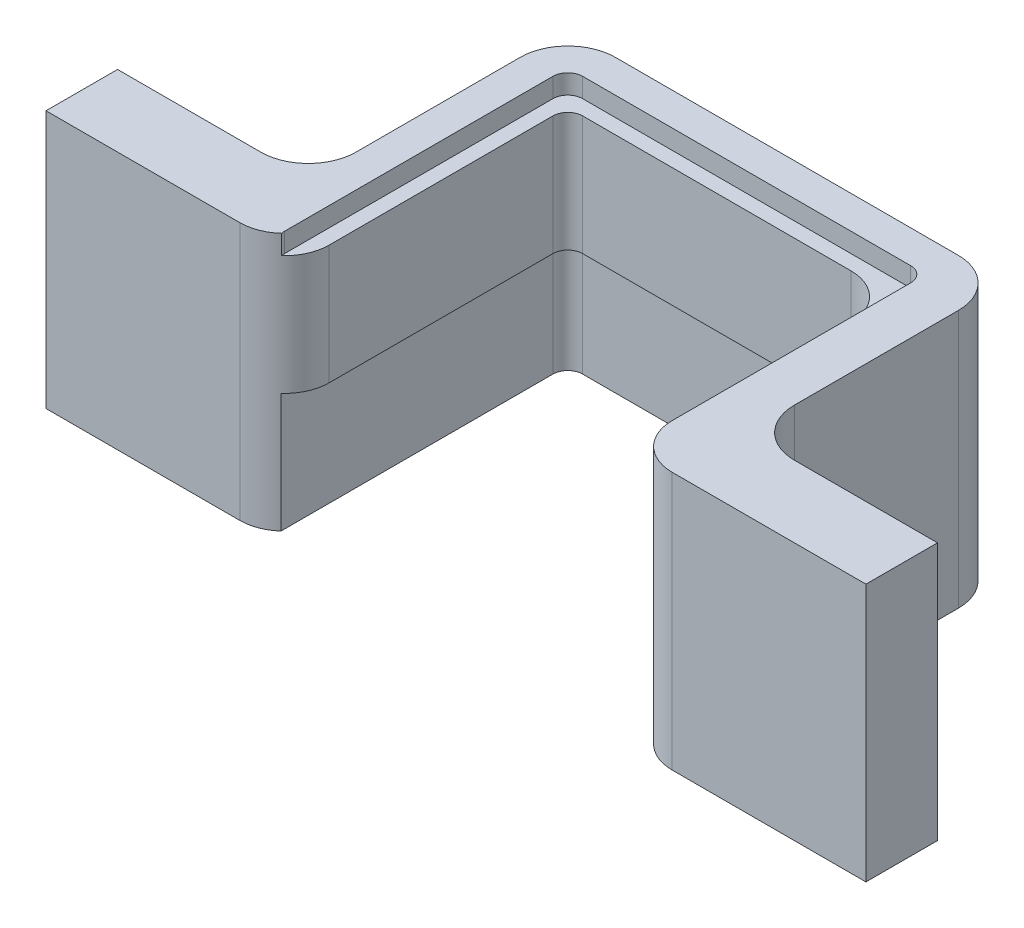
ISO-10303-21;
HEADER;
FILE_DESCRIPTION(('STEP AP214'),'2;1');
FILE_NAME('part.step','',(''),(''),'','','');
FILE_SCHEMA(('AUTOMOTIVE_DESIGN { 1 0 10303 214 1 1 1 1 }'));
ENDSEC;
DATA;
#1=APPLICATION_CONTEXT('core data for automotive mechanical design processes');
#2=APPLICATION_PROTOCOL_DEFINITION('international standard','automotive_design',2000,#1);
#3=PRODUCT_CONTEXT('',#1,'mechanical');
#4=PRODUCT('Part','Part','',(#3));
#5=PRODUCT_RELATED_PRODUCT_CATEGORY('part','',(#4));
#6=PRODUCT_DEFINITION_FORMATION('','',#4);
#7=PRODUCT_DEFINITION_CONTEXT('part definition',#1,'design');
#8=PRODUCT_DEFINITION('design','',#6,#7);
#9=PRODUCT_DEFINITION_SHAPE('','',#8);
#10=(LENGTH_UNIT() NAMED_UNIT(*) SI_UNIT(.MILLI.,.METRE.));
#11=(NAMED_UNIT(*) PLANE_ANGLE_UNIT() SI_UNIT($,.RADIAN.));
#12=(NAMED_UNIT(*) SI_UNIT($,.STERADIAN.) SOLID_ANGLE_UNIT());
#13=UNCERTAINTY_MEASURE_WITH_UNIT(LENGTH_MEASURE(1.E-05),#10,'distance_accuracy_value','');
#14=(GEOMETRIC_REPRESENTATION_CONTEXT(3) GLOBAL_UNCERTAINTY_ASSIGNED_CONTEXT((#13)) GLOBAL_UNIT_ASSIGNED_CONTEXT((#10,
#11,#12)) REPRESENTATION_CONTEXT('',''));
#15=CARTESIAN_POINT('',(0.,0.,0.));
#16=DIRECTION('',(0.,0.,1.));
#17=DIRECTION('',(1.,0.,0.));
#18=AXIS2_PLACEMENT_3D('',#15,#16,#17);
#19=CARTESIAN_POINT('',(-5.5,4.,3.00203961497151));
#20=DIRECTION('',(-1.,0.,0.));
#21=DIRECTION('',(0.,0.,1.));
#22=AXIS2_PLACEMENT_3D('',#19,#20,#21);
#23=PLANE('',#22);
#24=DIRECTION('',(0.,0.,-1.));
#25=VECTOR('',#24,1.);
#26=CARTESIAN_POINT('',(-5.5,0.,3.00203961497151));
#27=LINE('',#26,#25);
#28=CARTESIAN_POINT('',(-5.5,0.,3.49999999999999));
#29=VERTEX_POINT('',#28);
#30=CARTESIAN_POINT('',(-5.5,0.,-4.));
#31=VERTEX_POINT('',#30);
#32=EDGE_CURVE('E432',#29,#31,#27,.T.);
#33=ORIENTED_EDGE('',*,*,#32,.T.);
#34=DIRECTION('',(0.,-1.,0.));
#35=VECTOR('',#34,1.);
#36=CARTESIAN_POINT('',(-5.5,4.,-4.));
#37=LINE('',#36,#35);
#38=CARTESIAN_POINT('',(-5.5,4.,-4.));
#39=VERTEX_POINT('',#38);
#40=EDGE_CURVE('E11',#39,#31,#37,.T.);
#41=ORIENTED_EDGE('',*,*,#40,.F.);
#42=DIRECTION('',(0.,0.,-1.));
#43=VECTOR('',#42,1.);
#44=CARTESIAN_POINT('',(-5.5,4.,3.00203961497151));
#45=LINE('',#44,#43);
#46=CARTESIAN_POINT('',(-5.5,4.,3.49999999999999));
#47=VERTEX_POINT('',#46);
#48=EDGE_CURVE('E433',#47,#39,#45,.T.);
#49=ORIENTED_EDGE('',*,*,#48,.F.);
#50=DIRECTION('',(0.,-1.,0.));
#51=VECTOR('',#50,1.);
#52=CARTESIAN_POINT('',(-5.5,4.,3.49999999999999));
#53=LINE('',#52,#51);
#54=EDGE_CURVE('E448',#47,#29,#53,.T.);
#55=ORIENTED_EDGE('',*,*,#54,.T.);
#56=EDGE_LOOP('',(#33,#41,#49,#55));
#57=FACE_BOUND('',#56,.T.);
#58=ADVANCED_FACE('F35',(#57),#23,.F.);
#59=CARTESIAN_POINT('',(-5.,4.,-4.));
#60=DIRECTION('',(0.,-1.,0.));
#61=DIRECTION('',(0.,0.,-1.));
#62=AXIS2_PLACEMENT_3D('',#59,#60,#61);
#63=CYLINDRICAL_SURFACE('',#62,0.5);
#64=CARTESIAN_POINT('',(-5.,0.,-4.));
#65=DIRECTION('',(0.,-1.,0.));
#66=DIRECTION('',(0.,0.,-1.));
#67=AXIS2_PLACEMENT_3D('',#64,#65,#66);
#68=CIRCLE('',#67,0.5);
#69=CARTESIAN_POINT('',(-5.,0.,-4.5));
#70=VERTEX_POINT('',#69);
#71=EDGE_CURVE('E450',#31,#70,#68,.T.);
#72=ORIENTED_EDGE('',*,*,#71,.T.);
#73=DIRECTION('',(0.,-1.,0.));
#74=VECTOR('',#73,1.);
#75=CARTESIAN_POINT('',(-5.,4.,-4.5));
#76=LINE('',#75,#74);
#77=CARTESIAN_POINT('',(-5.,4.,-4.5));
#78=VERTEX_POINT('',#77);
#79=EDGE_CURVE('E42',#78,#70,#76,.T.);
#80=ORIENTED_EDGE('',*,*,#79,.F.);
#81=CARTESIAN_POINT('',(-5.,4.,-4.));
#82=DIRECTION('',(0.,-1.,0.));
#83=DIRECTION('',(0.,0.,-1.));
#84=AXIS2_PLACEMENT_3D('',#81,#82,#83);
#85=CIRCLE('',#84,0.5);
#86=EDGE_CURVE('E435',#39,#78,#85,.T.);
#87=ORIENTED_EDGE('',*,*,#86,.F.);
#88=ORIENTED_EDGE('',*,*,#40,.T.);
#89=EDGE_LOOP('',(#72,#80,#87,#88));
#90=FACE_BOUND('',#89,.T.);
#91=ADVANCED_FACE('F533',(#90),#63,.F.);
#92=CARTESIAN_POINT('',(4.,4.,-4.5));
#93=DIRECTION('',(0.,0.,-1.));
#94=DIRECTION('',(-1.,0.,0.));
#95=AXIS2_PLACEMENT_3D('',#92,#93,#94);
#96=PLANE('',#95);
#97=DIRECTION('',(1.,0.,0.));
#98=VECTOR('',#97,1.);
#99=CARTESIAN_POINT('',(4.,0.,-4.5));
#100=LINE('',#99,#98);
#101=CARTESIAN_POINT('',(4.,0.,-4.5));
#102=VERTEX_POINT('',#101);
#103=EDGE_CURVE('E452',#70,#102,#100,.T.);
#104=ORIENTED_EDGE('',*,*,#103,.T.);
#105=DIRECTION('',(0.,-1.,0.));
#106=VECTOR('',#105,1.);
#107=CARTESIAN_POINT('',(4.,4.,-4.5));
#108=LINE('',#107,#106);
#109=CARTESIAN_POINT('',(4.,4.,-4.5));
#110=VERTEX_POINT('',#109);
#111=EDGE_CURVE('E502',#110,#102,#108,.T.);
#112=ORIENTED_EDGE('',*,*,#111,.F.);
#113=DIRECTION('',(1.,0.,0.));
#114=VECTOR('',#113,1.);
#115=CARTESIAN_POINT('',(4.,4.,-4.5));
#116=LINE('',#115,#114);
#117=EDGE_CURVE('E438',#78,#110,#116,.T.);
#118=ORIENTED_EDGE('',*,*,#117,.F.);
#119=ORIENTED_EDGE('',*,*,#79,.T.);
#120=EDGE_LOOP('',(#104,#112,#118,#119));
#121=FACE_BOUND('',#120,.T.);
#122=ADVANCED_FACE('F509',(#121),#96,.F.);
#123=CARTESIAN_POINT('',(4.,4.,-3.));
#124=DIRECTION('',(0.,-1.,0.));
#125=DIRECTION('',(0.,0.,-1.));
#126=AXIS2_PLACEMENT_3D('',#123,#124,#125);
#127=CYLINDRICAL_SURFACE('',#126,1.5);
#128=CARTESIAN_POINT('',(4.,0.,-3.));
#129=DIRECTION('',(0.,-1.,0.));
#130=DIRECTION('',(0.,0.,-1.));
#131=AXIS2_PLACEMENT_3D('',#128,#129,#130);
#132=CIRCLE('',#131,1.5);
#133=CARTESIAN_POINT('',(5.5,0.,-3.));
#134=VERTEX_POINT('',#133);
#135=EDGE_CURVE('E454',#102,#134,#132,.T.);
#136=ORIENTED_EDGE('',*,*,#135,.T.);
#137=DIRECTION('',(0.,-1.,0.));
#138=VECTOR('',#137,1.);
#139=CARTESIAN_POINT('',(5.5,4.,-3.));
#140=LINE('',#139,#138);
#141=CARTESIAN_POINT('',(5.5,4.,-3.));
#142=VERTEX_POINT('',#141);
#143=EDGE_CURVE('E499',#142,#134,#140,.T.);
#144=ORIENTED_EDGE('',*,*,#143,.F.);
#145=CARTESIAN_POINT('',(4.,4.,-3.));
#146=DIRECTION('',(0.,-1.,0.));
#147=DIRECTION('',(0.,0.,-1.));
#148=AXIS2_PLACEMENT_3D('',#145,#146,#147);
#149=CIRCLE('',#148,1.5);
#150=EDGE_CURVE('E440',#110,#142,#149,.T.);
#151=ORIENTED_EDGE('',*,*,#150,.F.);
#152=ORIENTED_EDGE('',*,*,#111,.T.);
#153=EDGE_LOOP('',(#136,#144,#151,#152));
#154=FACE_BOUND('',#153,.T.);
#155=ADVANCED_FACE('F521',(#154),#127,.F.);
#156=CARTESIAN_POINT('',(5.5,4.,-3.));
#157=DIRECTION('',(1.,0.,0.));
#158=DIRECTION('',(0.,0.,-1.));
#159=AXIS2_PLACEMENT_3D('',#156,#157,#158);
#160=PLANE('',#159);
#161=DIRECTION('',(0.,0.,1.));
#162=VECTOR('',#161,1.);
#163=CARTESIAN_POINT('',(5.5,0.,-3.));
#164=LINE('',#163,#162);
#165=CARTESIAN_POINT('',(5.5,0.,-1.5));
#166=VERTEX_POINT('',#165);
#167=EDGE_CURVE('E456',#134,#166,#164,.T.);
#168=ORIENTED_EDGE('',*,*,#167,.T.);
#169=DIRECTION('',(0.,-1.,0.));
#170=VECTOR('',#169,1.);
#171=CARTESIAN_POINT('',(5.5,4.,-1.5));
#172=LINE('',#171,#170);
#173=CARTESIAN_POINT('',(5.5,4.,-1.5));
#174=VERTEX_POINT('',#173);
#175=EDGE_CURVE('E496',#174,#166,#172,.T.);
#176=ORIENTED_EDGE('',*,*,#175,.F.);
#177=DIRECTION('',(0.,0.,1.));
#178=VECTOR('',#177,1.);
#179=CARTESIAN_POINT('',(5.5,4.,-3.));
#180=LINE('',#179,#178);
#181=EDGE_CURVE('E442',#142,#174,#180,.T.);
#182=ORIENTED_EDGE('',*,*,#181,.F.);
#183=ORIENTED_EDGE('',*,*,#143,.T.);
#184=EDGE_LOOP('',(#168,#176,#182,#183));
#185=FACE_BOUND('',#184,.T.);
#186=ADVANCED_FACE('F525',(#185),#160,.F.);
#187=CARTESIAN_POINT('',(5.5,4.,-1.5));
#188=DIRECTION('',(0.,0.,-1.));
#189=DIRECTION('',(-1.,0.,0.));
#190=AXIS2_PLACEMENT_3D('',#187,#188,#189);
#191=PLANE('',#190);
#192=DIRECTION('',(1.,0.,0.));
#193=VECTOR('',#192,1.);
#194=CARTESIAN_POINT('',(5.5,0.,-1.5));
#195=LINE('',#194,#193);
#196=CARTESIAN_POINT('',(6.,0.,-1.5));
#197=VERTEX_POINT('',#196);
#198=EDGE_CURVE('E458',#166,#197,#195,.T.);
#199=ORIENTED_EDGE('',*,*,#198,.T.);
#200=DIRECTION('',(0.,-1.,0.));
#201=VECTOR('',#200,1.);
#202=CARTESIAN_POINT('',(6.,4.,-1.5));
#203=LINE('',#202,#201);
#204=CARTESIAN_POINT('',(6.,4.,-1.5));
#205=VERTEX_POINT('',#204);
#206=EDGE_CURVE('E494',#205,#197,#203,.T.);
#207=ORIENTED_EDGE('',*,*,#206,.F.);
#208=DIRECTION('',(1.,0.,0.));
#209=VECTOR('',#208,1.);
#210=CARTESIAN_POINT('',(5.5,4.,-1.5));
#211=LINE('',#210,#209);
#212=EDGE_CURVE('E444',#174,#205,#211,.T.);
#213=ORIENTED_EDGE('',*,*,#212,.F.);
#214=ORIENTED_EDGE('',*,*,#175,.T.);
#215=EDGE_LOOP('',(#199,#207,#213,#214));
#216=FACE_BOUND('',#215,.T.);
#217=ADVANCED_FACE('F645',(#216),#191,.F.);
#218=CARTESIAN_POINT('',(6.,4.,-1.5));
#219=DIRECTION('',(1.,0.,0.));
#220=DIRECTION('',(0.,0.,-1.));
#221=AXIS2_PLACEMENT_3D('',#218,#219,#220);
#222=PLANE('',#221);
#223=ORIENTED_EDGE('',*,*,#206,.T.);
#224=DIRECTION('',(0.,0.,1.));
#225=VECTOR('',#224,1.);
#226=CARTESIAN_POINT('',(6.,0.,0.));
#227=LINE('',#226,#225);
#228=CARTESIAN_POINT('',(6.,0.,-4.5));
#229=VERTEX_POINT('',#228);
#230=EDGE_CURVE('E254',#229,#197,#227,.T.);
#231=ORIENTED_EDGE('',*,*,#230,.F.);
#232=DIRECTION('',(0.,1.,0.));
#233=VECTOR('',#232,1.);
#234=CARTESIAN_POINT('',(6.,-4.,-4.5));
#235=LINE('',#234,#233);
#236=CARTESIAN_POINT('',(6.,-4.,-4.5));
#237=VERTEX_POINT('',#236);
#238=EDGE_CURVE('E248',#237,#229,#235,.T.);
#239=ORIENTED_EDGE('',*,*,#238,.F.);
#240=DIRECTION('',(0.,0.,1.));
#241=VECTOR('',#240,1.);
#242=CARTESIAN_POINT('',(6.,-4.,0.));
#243=LINE('',#242,#241);
#244=CARTESIAN_POINT('',(6.,-4.,3.49999999999999));
#245=VERTEX_POINT('',#244);
#246=EDGE_CURVE('E253',#237,#245,#243,.T.);
#247=ORIENTED_EDGE('',*,*,#246,.T.);
#248=DIRECTION('',(0.,-1.,0.));
#249=VECTOR('',#248,1.);
#250=CARTESIAN_POINT('',(6.,4.,3.49999999999999));
#251=LINE('',#250,#249);
#252=CARTESIAN_POINT('',(6.,4.65,3.50000000000001));
#253=VERTEX_POINT('',#252);
#254=EDGE_CURVE('E492',#253,#245,#251,.T.);
#255=ORIENTED_EDGE('',*,*,#254,.F.);
#256=DIRECTION('',(0.,0.,1.));
#257=VECTOR('',#256,1.);
#258=CARTESIAN_POINT('',(6.,4.65,3.50000000000001));
#259=LINE('',#258,#257);
#260=CARTESIAN_POINT('',(6.,4.65,-4.5));
#261=VERTEX_POINT('',#260);
#262=EDGE_CURVE('E342',#261,#253,#259,.T.);
#263=ORIENTED_EDGE('',*,*,#262,.F.);
#264=DIRECTION('',(0.,-1.,0.));
#265=VECTOR('',#264,1.);
#266=CARTESIAN_POINT('',(6.,4.65,-4.5));
#267=LINE('',#266,#265);
#268=CARTESIAN_POINT('',(6.,4.,-4.5));
#269=VERTEX_POINT('',#268);
#270=EDGE_CURVE('E429',#261,#269,#267,.T.);
#271=ORIENTED_EDGE('',*,*,#270,.T.);
#272=DIRECTION('',(0.,0.,1.));
#273=VECTOR('',#272,1.);
#274=CARTESIAN_POINT('',(6.,4.,3.50000000000001));
#275=LINE('',#274,#273);
#276=EDGE_CURVE('E401',#269,#205,#275,.T.);
#277=ORIENTED_EDGE('',*,*,#276,.T.);
#278=EDGE_LOOP('',(#223,#231,#239,#247,#255,#263,#271,#277));
#279=FACE_BOUND('',#278,.T.);
#280=ADVANCED_FACE('F251',(#279),#222,.F.);
#281=CARTESIAN_POINT('',(7.5,4.,3.5));
#282=DIRECTION('',(0.,-1.,0.));
#283=DIRECTION('',(0.,0.,-1.));
#284=AXIS2_PLACEMENT_3D('',#281,#282,#283);
#285=CYLINDRICAL_SURFACE('',#284,1.5);
#286=ORIENTED_EDGE('',*,*,#254,.T.);
#287=CARTESIAN_POINT('',(7.5,-4.,3.5));
#288=DIRECTION('',(0.,-1.,0.));
#289=DIRECTION('',(0.,0.,-1.));
#290=AXIS2_PLACEMENT_3D('',#287,#288,#289);
#291=CIRCLE('',#290,1.5);
#292=CARTESIAN_POINT('',(7.50000000000001,-4.,5.));
#293=VERTEX_POINT('',#292);
#294=EDGE_CURVE('E273',#293,#245,#291,.T.);
#295=ORIENTED_EDGE('',*,*,#294,.F.);
#296=DIRECTION('',(0.,-1.,0.));
#297=VECTOR('',#296,1.);
#298=CARTESIAN_POINT('',(7.50000000000001,4.,5.));
#299=LINE('',#298,#297);
#300=CARTESIAN_POINT('',(7.5,4.65,5.));
#301=VERTEX_POINT('',#300);
#302=EDGE_CURVE('E490',#301,#293,#299,.T.);
#303=ORIENTED_EDGE('',*,*,#302,.F.);
#304=CARTESIAN_POINT('',(7.5,4.65,3.5));
#305=DIRECTION('',(0.,1.,0.));
#306=DIRECTION('',(0.,0.,1.));
#307=AXIS2_PLACEMENT_3D('',#304,#305,#306);
#308=CIRCLE('',#307,1.5);
#309=EDGE_CURVE('E346',#253,#301,#308,.T.);
#310=ORIENTED_EDGE('',*,*,#309,.F.);
#311=EDGE_LOOP('',(#286,#295,#303,#310));
#312=FACE_BOUND('',#311,.T.);
#313=ADVANCED_FACE('F601',(#312),#285,.T.);
#314=CARTESIAN_POINT('',(7.50000000000001,4.,5.));
#315=DIRECTION('',(0.,0.,-1.));
#316=DIRECTION('',(-1.,0.,0.));
#317=AXIS2_PLACEMENT_3D('',#314,#315,#316);
#318=PLANE('',#317);
#319=ORIENTED_EDGE('',*,*,#302,.T.);
#320=DIRECTION('',(-1.,0.,0.));
#321=VECTOR('',#320,1.);
#322=CARTESIAN_POINT('',(0.,-4.,5.));
#323=LINE('',#322,#321);
#324=CARTESIAN_POINT('',(14.,-4.,5.));
#325=VERTEX_POINT('',#324);
#326=EDGE_CURVE('E321',#325,#293,#323,.T.);
#327=ORIENTED_EDGE('',*,*,#326,.F.);
#328=DIRECTION('',(0.,-1.,0.));
#329=VECTOR('',#328,1.);
#330=CARTESIAN_POINT('',(14.,4.,5.));
#331=LINE('',#330,#329);
#332=CARTESIAN_POINT('',(14.,4.65,5.));
#333=VERTEX_POINT('',#332);
#334=EDGE_CURVE('E488',#333,#325,#331,.T.);
#335=ORIENTED_EDGE('',*,*,#334,.F.);
#336=DIRECTION('',(1.,0.,0.));
#337=VECTOR('',#336,1.);
#338=CARTESIAN_POINT('',(14.,4.65,5.));
#339=LINE('',#338,#337);
#340=EDGE_CURVE('E349',#301,#333,#339,.T.);
#341=ORIENTED_EDGE('',*,*,#340,.F.);
#342=EDGE_LOOP('',(#319,#327,#335,#341));
#343=FACE_BOUND('',#342,.T.);
#344=ADVANCED_FACE('F598',(#343),#318,.F.);
#345=CARTESIAN_POINT('',(14.,4.,2.6));
#346=DIRECTION('',(-1.,0.,0.));
#347=DIRECTION('',(0.,0.,1.));
#348=AXIS2_PLACEMENT_3D('',#345,#346,#347);
#349=PLANE('',#348);
#350=ORIENTED_EDGE('',*,*,#334,.T.);
#351=DIRECTION('',(0.,0.,1.));
#352=VECTOR('',#351,1.);
#353=CARTESIAN_POINT('',(14.,-4.,0.));
#354=LINE('',#353,#352);
#355=CARTESIAN_POINT('',(14.,-4.,2.6));
#356=VERTEX_POINT('',#355);
#357=EDGE_CURVE('E318',#356,#325,#354,.T.);
#358=ORIENTED_EDGE('',*,*,#357,.F.);
#359=DIRECTION('',(0.,-1.,0.));
#360=VECTOR('',#359,1.);
#361=CARTESIAN_POINT('',(14.,4.,2.6));
#362=LINE('',#361,#360);
#363=CARTESIAN_POINT('',(14.,4.65,2.6));
#364=VERTEX_POINT('',#363);
#365=EDGE_CURVE('E486',#364,#356,#362,.T.);
#366=ORIENTED_EDGE('',*,*,#365,.F.);
#367=DIRECTION('',(0.,0.,-1.));
#368=VECTOR('',#367,1.);
#369=CARTESIAN_POINT('',(14.,4.65,2.6));
#370=LINE('',#369,#368);
#371=EDGE_CURVE('E352',#333,#364,#370,.T.);
#372=ORIENTED_EDGE('',*,*,#371,.F.);
#373=EDGE_LOOP('',(#350,#358,#366,#372));
#374=FACE_BOUND('',#373,.T.);
#375=ADVANCED_FACE('F594',(#374),#349,.F.);
#376=CARTESIAN_POINT('',(9.2,4.,2.6));
#377=DIRECTION('',(0.,0.,1.));
#378=DIRECTION('',(1.,0.,0.));
#379=AXIS2_PLACEMENT_3D('',#376,#377,#378);
#380=PLANE('',#379);
#381=ORIENTED_EDGE('',*,*,#365,.T.);
#382=DIRECTION('',(1.,0.,0.));
#383=VECTOR('',#382,1.);
#384=CARTESIAN_POINT('',(0.,-4.,2.6));
#385=LINE('',#384,#383);
#386=CARTESIAN_POINT('',(9.2,-4.,2.6));
#387=VERTEX_POINT('',#386);
#388=EDGE_CURVE('E315',#387,#356,#385,.T.);
#389=ORIENTED_EDGE('',*,*,#388,.F.);
#390=DIRECTION('',(0.,-1.,0.));
#391=VECTOR('',#390,1.);
#392=CARTESIAN_POINT('',(9.2,4.,2.6));
#393=LINE('',#392,#391);
#394=CARTESIAN_POINT('',(9.20000000000001,4.65,2.6));
#395=VERTEX_POINT('',#394);
#396=EDGE_CURVE('E484',#395,#387,#393,.T.);
#397=ORIENTED_EDGE('',*,*,#396,.F.);
#398=DIRECTION('',(-1.,0.,0.));
#399=VECTOR('',#398,1.);
#400=CARTESIAN_POINT('',(14.,4.65,2.6));
#401=LINE('',#400,#399);
#402=EDGE_CURVE('E355',#364,#395,#401,.T.);
#403=ORIENTED_EDGE('',*,*,#402,.F.);
#404=EDGE_LOOP('',(#381,#389,#397,#403));
#405=FACE_BOUND('',#404,.T.);
#406=ADVANCED_FACE('F590',(#405),#380,.F.);
#407=CARTESIAN_POINT('',(9.2,4.,0.999999999999999));
#408=DIRECTION('',(0.,-1.,0.));
#409=DIRECTION('',(0.,0.,-1.));
#410=AXIS2_PLACEMENT_3D('',#407,#408,#409);
#411=CYLINDRICAL_SURFACE('',#410,1.6);
#412=ORIENTED_EDGE('',*,*,#396,.T.);
#413=CARTESIAN_POINT('',(9.2,-4.,0.999999999999999));
#414=DIRECTION('',(0.,-1.,0.));
#415=DIRECTION('',(0.,0.,-1.));
#416=AXIS2_PLACEMENT_3D('',#413,#414,#415);
#417=CIRCLE('',#416,1.6);
#418=CARTESIAN_POINT('',(7.6,-4.,1.));
#419=VERTEX_POINT('',#418);
#420=EDGE_CURVE('E312',#419,#387,#417,.F.);
#421=ORIENTED_EDGE('',*,*,#420,.F.);
#422=DIRECTION('',(0.,-1.,0.));
#423=VECTOR('',#422,1.);
#424=CARTESIAN_POINT('',(7.6,4.,1.));
#425=LINE('',#424,#423);
#426=CARTESIAN_POINT('',(7.6,4.65,0.999999999999988));
#427=VERTEX_POINT('',#426);
#428=EDGE_CURVE('E482',#427,#419,#425,.T.);
#429=ORIENTED_EDGE('',*,*,#428,.F.);
#430=CARTESIAN_POINT('',(9.2,4.65,0.999999999999999));
#431=DIRECTION('',(0.,-1.,0.));
#432=DIRECTION('',(0.,0.,1.));
#433=AXIS2_PLACEMENT_3D('',#430,#431,#432);
#434=CIRCLE('',#433,1.6);
#435=EDGE_CURVE('E358',#395,#427,#434,.T.);
#436=ORIENTED_EDGE('',*,*,#435,.F.);
#437=EDGE_LOOP('',(#412,#421,#429,#436));
#438=FACE_BOUND('',#437,.T.);
#439=ADVANCED_FACE('F587',(#438),#411,.F.);
#440=CARTESIAN_POINT('',(7.6,4.,-4.49999999999999));
#441=DIRECTION('',(-1.,0.,0.));
#442=DIRECTION('',(0.,0.,1.));
#443=AXIS2_PLACEMENT_3D('',#440,#441,#442);
#444=PLANE('',#443);
#445=ORIENTED_EDGE('',*,*,#428,.T.);
#446=DIRECTION('',(0.,0.,1.));
#447=VECTOR('',#446,1.);
#448=CARTESIAN_POINT('',(7.6,-4.,0.));
#449=LINE('',#448,#447);
#450=CARTESIAN_POINT('',(7.6,-4.,-4.49999999999999));
#451=VERTEX_POINT('',#450);
#452=EDGE_CURVE('E309',#451,#419,#449,.T.);
#453=ORIENTED_EDGE('',*,*,#452,.F.);
#454=DIRECTION('',(0.,-1.,0.));
#455=VECTOR('',#454,1.);
#456=CARTESIAN_POINT('',(7.6,4.,-4.49999999999999));
#457=LINE('',#456,#455);
#458=CARTESIAN_POINT('',(7.6,4.65,-4.49999999999999));
#459=VERTEX_POINT('',#458);
#460=EDGE_CURVE('E480',#459,#451,#457,.T.);
#461=ORIENTED_EDGE('',*,*,#460,.F.);
#462=DIRECTION('',(0.,0.,-1.));
#463=VECTOR('',#462,1.);
#464=CARTESIAN_POINT('',(7.6,4.65,-4.49999999999999));
#465=LINE('',#464,#463);
#466=EDGE_CURVE('E361',#427,#459,#465,.T.);
#467=ORIENTED_EDGE('',*,*,#466,.F.);
#468=EDGE_LOOP('',(#445,#453,#461,#467));
#469=FACE_BOUND('',#468,.T.);
#470=ADVANCED_FACE('F582',(#469),#444,.F.);
#471=CARTESIAN_POINT('',(6.,4.,-4.5));
#472=DIRECTION('',(0.,-1.,0.));
#473=DIRECTION('',(0.,0.,-1.));
#474=AXIS2_PLACEMENT_3D('',#471,#472,#473);
#475=CYLINDRICAL_SURFACE('',#474,1.6);
#476=ORIENTED_EDGE('',*,*,#460,.T.);
#477=CARTESIAN_POINT('',(6.,-4.,-4.5));
#478=DIRECTION('',(0.,-1.,0.));
#479=DIRECTION('',(0.,0.,-1.));
#480=AXIS2_PLACEMENT_3D('',#477,#478,#479);
#481=CIRCLE('',#480,1.6);
#482=CARTESIAN_POINT('',(6.,-4.,-6.1));
#483=VERTEX_POINT('',#482);
#484=EDGE_CURVE('E306',#483,#451,#481,.T.);
#485=ORIENTED_EDGE('',*,*,#484,.F.);
#486=DIRECTION('',(0.,-1.,0.));
#487=VECTOR('',#486,1.);
#488=CARTESIAN_POINT('',(5.99999999999999,4.,-6.1));
#489=LINE('',#488,#487);
#490=CARTESIAN_POINT('',(5.99999999999999,4.65,-6.1));
#491=VERTEX_POINT('',#490);
#492=EDGE_CURVE('E478',#491,#483,#489,.T.);
#493=ORIENTED_EDGE('',*,*,#492,.F.);
#494=CARTESIAN_POINT('',(6.,4.65,-4.5));
#495=DIRECTION('',(0.,1.,0.));
#496=DIRECTION('',(0.,0.,1.));
#497=AXIS2_PLACEMENT_3D('',#494,#495,#496);
#498=CIRCLE('',#497,1.6);
#499=EDGE_CURVE('E364',#459,#491,#498,.T.);
#500=ORIENTED_EDGE('',*,*,#499,.F.);
#501=EDGE_LOOP('',(#476,#485,#493,#500));
#502=FACE_BOUND('',#501,.T.);
#503=ADVANCED_FACE('F578',(#502),#475,.T.);
#504=CARTESIAN_POINT('',(-5.49999999999999,4.,-6.1));
#505=DIRECTION('',(0.,0.,1.));
#506=DIRECTION('',(1.,0.,0.));
#507=AXIS2_PLACEMENT_3D('',#504,#505,#506);
#508=PLANE('',#507);
#509=ORIENTED_EDGE('',*,*,#492,.T.);
#510=DIRECTION('',(1.,0.,0.));
#511=VECTOR('',#510,1.);
#512=CARTESIAN_POINT('',(0.,-4.,-6.1));
#513=LINE('',#512,#511);
#514=CARTESIAN_POINT('',(-5.49999999999999,-4.,-6.1));
#515=VERTEX_POINT('',#514);
#516=EDGE_CURVE('E303',#515,#483,#513,.T.);
#517=ORIENTED_EDGE('',*,*,#516,.F.);
#518=DIRECTION('',(0.,-1.,0.));
#519=VECTOR('',#518,1.);
#520=CARTESIAN_POINT('',(-5.49999999999999,4.,-6.1));
#521=LINE('',#520,#519);
#522=CARTESIAN_POINT('',(-5.49999999999999,4.65,-6.1));
#523=VERTEX_POINT('',#522);
#524=EDGE_CURVE('E476',#523,#515,#521,.T.);
#525=ORIENTED_EDGE('',*,*,#524,.F.);
#526=DIRECTION('',(-1.,0.,0.));
#527=VECTOR('',#526,1.);
#528=CARTESIAN_POINT('',(-5.49999999999999,4.65,-6.1));
#529=LINE('',#528,#527);
#530=EDGE_CURVE('E367',#491,#523,#529,.T.);
#531=ORIENTED_EDGE('',*,*,#530,.F.);
#532=EDGE_LOOP('',(#509,#517,#525,#531));
#533=FACE_BOUND('',#532,.T.);
#534=ADVANCED_FACE('F575',(#533),#508,.F.);
#535=CARTESIAN_POINT('',(-5.5,4.,-4.5));
#536=DIRECTION('',(0.,-1.,0.));
#537=DIRECTION('',(0.,0.,-1.));
#538=AXIS2_PLACEMENT_3D('',#535,#536,#537);
#539=CYLINDRICAL_SURFACE('',#538,1.6);
#540=ORIENTED_EDGE('',*,*,#524,.T.);
#541=CARTESIAN_POINT('',(-5.5,-4.,-4.5));
#542=DIRECTION('',(0.,-1.,0.));
#543=DIRECTION('',(0.,0.,-1.));
#544=AXIS2_PLACEMENT_3D('',#541,#542,#543);
#545=CIRCLE('',#544,1.6);
#546=CARTESIAN_POINT('',(-7.1,-4.,-4.49999999999999));
#547=VERTEX_POINT('',#546);
#548=EDGE_CURVE('E300',#547,#515,#545,.T.);
#549=ORIENTED_EDGE('',*,*,#548,.F.);
#550=DIRECTION('',(0.,-1.,0.));
#551=VECTOR('',#550,1.);
#552=CARTESIAN_POINT('',(-7.1,4.,-4.49999999999999));
#553=LINE('',#552,#551);
#554=CARTESIAN_POINT('',(-7.1,4.65,-4.49999999999999));
#555=VERTEX_POINT('',#554);
#556=EDGE_CURVE('E474',#555,#547,#553,.T.);
#557=ORIENTED_EDGE('',*,*,#556,.F.);
#558=CARTESIAN_POINT('',(-5.5,4.65,-4.5));
#559=DIRECTION('',(0.,1.,0.));
#560=DIRECTION('',(0.,0.,-1.));
#561=AXIS2_PLACEMENT_3D('',#558,#559,#560);
#562=CIRCLE('',#561,1.6);
#563=EDGE_CURVE('E370',#523,#555,#562,.T.);
#564=ORIENTED_EDGE('',*,*,#563,.F.);
#565=EDGE_LOOP('',(#540,#549,#557,#564));
#566=FACE_BOUND('',#565,.T.);
#567=ADVANCED_FACE('F570',(#566),#539,.T.);
#568=CARTESIAN_POINT('',(-7.1,4.,1.));
#569=DIRECTION('',(1.,0.,0.));
#570=DIRECTION('',(0.,0.,-1.));
#571=AXIS2_PLACEMENT_3D('',#568,#569,#570);
#572=PLANE('',#571);
#573=ORIENTED_EDGE('',*,*,#556,.T.);
#574=DIRECTION('',(0.,0.,-1.));
#575=VECTOR('',#574,1.);
#576=CARTESIAN_POINT('',(-7.1,-4.,0.));
#577=LINE('',#576,#575);
#578=CARTESIAN_POINT('',(-7.1,-4.,1.));
#579=VERTEX_POINT('',#578);
#580=EDGE_CURVE('E297',#579,#547,#577,.T.);
#581=ORIENTED_EDGE('',*,*,#580,.F.);
#582=DIRECTION('',(0.,-1.,0.));
#583=VECTOR('',#582,1.);
#584=CARTESIAN_POINT('',(-7.1,4.,1.));
#585=LINE('',#584,#583);
#586=CARTESIAN_POINT('',(-7.1,4.65,0.999999999999989));
#587=VERTEX_POINT('',#586);
#588=EDGE_CURVE('E472',#587,#579,#585,.T.);
#589=ORIENTED_EDGE('',*,*,#588,.F.);
#590=DIRECTION('',(0.,0.,1.));
#591=VECTOR('',#590,1.);
#592=CARTESIAN_POINT('',(-7.1,4.65,-4.49999999999999));
#593=LINE('',#592,#591);
#594=EDGE_CURVE('E373',#555,#587,#593,.T.);
#595=ORIENTED_EDGE('',*,*,#594,.F.);
#596=EDGE_LOOP('',(#573,#581,#589,#595));
#597=FACE_BOUND('',#596,.T.);
#598=ADVANCED_FACE('F566',(#597),#572,.F.);
#599=CARTESIAN_POINT('',(-8.7,4.,1.));
#600=DIRECTION('',(0.,-1.,0.));
#601=DIRECTION('',(0.,0.,-1.));
#602=AXIS2_PLACEMENT_3D('',#599,#600,#601);
#603=CYLINDRICAL_SURFACE('',#602,1.6);
#604=ORIENTED_EDGE('',*,*,#588,.T.);
#605=CARTESIAN_POINT('',(-8.7,-4.,1.));
#606=DIRECTION('',(0.,-1.,0.));
#607=DIRECTION('',(0.,0.,-1.));
#608=AXIS2_PLACEMENT_3D('',#605,#606,#607);
#609=CIRCLE('',#608,1.6);
#610=CARTESIAN_POINT('',(-8.7,-4.,2.6));
#611=VERTEX_POINT('',#610);
#612=EDGE_CURVE('E294',#611,#579,#609,.F.);
#613=ORIENTED_EDGE('',*,*,#612,.F.);
#614=DIRECTION('',(0.,-1.,0.));
#615=VECTOR('',#614,1.);
#616=CARTESIAN_POINT('',(-8.7,4.,2.6));
#617=LINE('',#616,#615);
#618=CARTESIAN_POINT('',(-8.70000000000001,4.65,2.6));
#619=VERTEX_POINT('',#618);
#620=EDGE_CURVE('E470',#619,#611,#617,.T.);
#621=ORIENTED_EDGE('',*,*,#620,.F.);
#622=CARTESIAN_POINT('',(-8.7,4.65,1.));
#623=DIRECTION('',(0.,-1.,0.));
#624=DIRECTION('',(0.,0.,1.));
#625=AXIS2_PLACEMENT_3D('',#622,#623,#624);
#626=CIRCLE('',#625,1.6);
#627=EDGE_CURVE('E376',#587,#619,#626,.T.);
#628=ORIENTED_EDGE('',*,*,#627,.F.);
#629=EDGE_LOOP('',(#604,#613,#621,#628));
#630=FACE_BOUND('',#629,.T.);
#631=ADVANCED_FACE('F563',(#630),#603,.F.);
#632=CARTESIAN_POINT('',(-13.5,4.,2.6));
#633=DIRECTION('',(0.,0.,1.));
#634=DIRECTION('',(1.,0.,0.));
#635=AXIS2_PLACEMENT_3D('',#632,#633,#634);
#636=PLANE('',#635);
#637=ORIENTED_EDGE('',*,*,#620,.T.);
#638=DIRECTION('',(1.,0.,0.));
#639=VECTOR('',#638,1.);
#640=CARTESIAN_POINT('',(0.,-4.,2.6));
#641=LINE('',#640,#639);
#642=CARTESIAN_POINT('',(-13.5,-4.,2.6));
#643=VERTEX_POINT('',#642);
#644=EDGE_CURVE('E291',#643,#611,#641,.T.);
#645=ORIENTED_EDGE('',*,*,#644,.F.);
#646=DIRECTION('',(0.,-1.,0.));
#647=VECTOR('',#646,1.);
#648=CARTESIAN_POINT('',(-13.5,4.,2.6));
#649=LINE('',#648,#647);
#650=CARTESIAN_POINT('',(-13.5,4.65,2.6));
#651=VERTEX_POINT('',#650);
#652=EDGE_CURVE('E468',#651,#643,#649,.T.);
#653=ORIENTED_EDGE('',*,*,#652,.F.);
#654=DIRECTION('',(-1.,0.,0.));
#655=VECTOR('',#654,1.);
#656=CARTESIAN_POINT('',(-13.5,4.65,2.6));
#657=LINE('',#656,#655);
#658=EDGE_CURVE('E379',#619,#651,#657,.T.);
#659=ORIENTED_EDGE('',*,*,#658,.F.);
#660=EDGE_LOOP('',(#637,#645,#653,#659));
#661=FACE_BOUND('',#660,.T.);
#662=ADVANCED_FACE('F558',(#661),#636,.F.);
#663=CARTESIAN_POINT('',(-13.5,4.,5.));
#664=DIRECTION('',(1.,0.,0.));
#665=DIRECTION('',(0.,0.,-1.));
#666=AXIS2_PLACEMENT_3D('',#663,#664,#665);
#667=PLANE('',#666);
#668=ORIENTED_EDGE('',*,*,#652,.T.);
#669=DIRECTION('',(0.,0.,-1.));
#670=VECTOR('',#669,1.);
#671=CARTESIAN_POINT('',(-13.5,-4.,0.));
#672=LINE('',#671,#670);
#673=CARTESIAN_POINT('',(-13.5,-4.,5.));
#674=VERTEX_POINT('',#673);
#675=EDGE_CURVE('E288',#674,#643,#672,.T.);
#676=ORIENTED_EDGE('',*,*,#675,.F.);
#677=DIRECTION('',(0.,-1.,0.));
#678=VECTOR('',#677,1.);
#679=CARTESIAN_POINT('',(-13.5,4.,5.));
#680=LINE('',#679,#678);
#681=CARTESIAN_POINT('',(-13.5,4.65,5.));
#682=VERTEX_POINT('',#681);
#683=EDGE_CURVE('E466',#682,#674,#680,.T.);
#684=ORIENTED_EDGE('',*,*,#683,.F.);
#685=DIRECTION('',(0.,0.,1.));
#686=VECTOR('',#685,1.);
#687=CARTESIAN_POINT('',(-13.5,4.65,2.6));
#688=LINE('',#687,#686);
#689=EDGE_CURVE('E382',#651,#682,#688,.T.);
#690=ORIENTED_EDGE('',*,*,#689,.F.);
#691=EDGE_LOOP('',(#668,#676,#684,#690));
#692=FACE_BOUND('',#691,.T.);
#693=ADVANCED_FACE('F552',(#692),#667,.F.);
#694=CARTESIAN_POINT('',(-7.00000000000001,4.,5.));
#695=DIRECTION('',(0.,0.,-1.));
#696=DIRECTION('',(-1.,0.,0.));
#697=AXIS2_PLACEMENT_3D('',#694,#695,#696);
#698=PLANE('',#697);
#699=ORIENTED_EDGE('',*,*,#683,.T.);
#700=DIRECTION('',(-1.,0.,0.));
#701=VECTOR('',#700,1.);
#702=CARTESIAN_POINT('',(0.,-4.,5.));
#703=LINE('',#702,#701);
#704=CARTESIAN_POINT('',(-7.00000000000001,-4.,5.));
#705=VERTEX_POINT('',#704);
#706=EDGE_CURVE('E285',#705,#674,#703,.T.);
#707=ORIENTED_EDGE('',*,*,#706,.F.);
#708=DIRECTION('',(0.,-1.,0.));
#709=VECTOR('',#708,1.);
#710=CARTESIAN_POINT('',(-7.00000000000001,4.,5.));
#711=LINE('',#710,#709);
#712=CARTESIAN_POINT('',(-7.00000000000001,4.65,5.));
#713=VERTEX_POINT('',#712);
#714=EDGE_CURVE('E464',#713,#705,#711,.T.);
#715=ORIENTED_EDGE('',*,*,#714,.F.);
#716=DIRECTION('',(1.,0.,0.));
#717=VECTOR('',#716,1.);
#718=CARTESIAN_POINT('',(-13.5,4.65,5.));
#719=LINE('',#718,#717);
#720=EDGE_CURVE('E385',#682,#713,#719,.T.);
#721=ORIENTED_EDGE('',*,*,#720,.F.);
#722=EDGE_LOOP('',(#699,#707,#715,#721));
#723=FACE_BOUND('',#722,.T.);
#724=ADVANCED_FACE('F548',(#723),#698,.F.);
#725=CARTESIAN_POINT('',(-7.,4.,3.5));
#726=DIRECTION('',(0.,-1.,0.));
#727=DIRECTION('',(0.,0.,-1.));
#728=AXIS2_PLACEMENT_3D('',#725,#726,#727);
#729=CYLINDRICAL_SURFACE('',#728,1.5);
#730=ORIENTED_EDGE('',*,*,#714,.T.);
#731=CARTESIAN_POINT('',(-7.,-4.,3.5));
#732=DIRECTION('',(0.,-1.,0.));
#733=DIRECTION('',(0.,0.,-1.));
#734=AXIS2_PLACEMENT_3D('',#731,#732,#733);
#735=CIRCLE('',#734,1.5);
#736=CARTESIAN_POINT('',(-6.,-4.,4.6180339887499));
#737=VERTEX_POINT('',#736);
#738=EDGE_CURVE('E282',#737,#705,#735,.T.);
#739=ORIENTED_EDGE('',*,*,#738,.F.);
#740=DIRECTION('',(0.,1.,0.));
#741=VECTOR('',#740,1.);
#742=CARTESIAN_POINT('',(-6.,-4.,4.6180339887499));
#743=LINE('',#742,#741);
#744=CARTESIAN_POINT('',(-6.,0.,4.6180339887499));
#745=VERTEX_POINT('',#744);
#746=EDGE_CURVE('E324',#737,#745,#743,.T.);
#747=ORIENTED_EDGE('',*,*,#746,.T.);
#748=CARTESIAN_POINT('',(-7.,0.,3.5));
#749=DIRECTION('',(0.,1.,0.));
#750=DIRECTION('',(0.,0.,1.));
#751=AXIS2_PLACEMENT_3D('',#748,#749,#750);
#752=CIRCLE('',#751,1.5);
#753=EDGE_CURVE('E436',#745,#29,#752,.T.);
#754=ORIENTED_EDGE('',*,*,#753,.T.);
#755=ORIENTED_EDGE('',*,*,#54,.F.);
#756=CARTESIAN_POINT('',(-7.,4.,3.5));
#757=DIRECTION('',(0.,1.,0.));
#758=DIRECTION('',(0.,0.,1.));
#759=AXIS2_PLACEMENT_3D('',#756,#757,#758);
#760=CIRCLE('',#759,1.5);
#761=CARTESIAN_POINT('',(-5.98831355471949,4.,4.60747033207923));
#762=VERTEX_POINT('',#761);
#763=EDGE_CURVE('E446',#762,#47,#760,.T.);
#764=ORIENTED_EDGE('',*,*,#763,.F.);
#765=DIRECTION('',(0.,-1.,0.));
#766=VECTOR('',#765,1.);
#767=CARTESIAN_POINT('',(-5.98831355471949,4.65,4.60747033207923));
#768=LINE('',#767,#766);
#769=CARTESIAN_POINT('',(-5.98831355471949,4.65,4.60747033207923));
#770=VERTEX_POINT('',#769);
#771=EDGE_CURVE('E426',#770,#762,#768,.T.);
#772=ORIENTED_EDGE('',*,*,#771,.F.);
#773=CARTESIAN_POINT('',(-7.,4.65,3.5));
#774=DIRECTION('',(0.,1.,0.));
#775=DIRECTION('',(0.,0.,-1.));
#776=AXIS2_PLACEMENT_3D('',#773,#774,#775);
#777=CIRCLE('',#776,1.5);
#778=EDGE_CURVE('E388',#713,#770,#777,.T.);
#779=ORIENTED_EDGE('',*,*,#778,.F.);
#780=EDGE_LOOP('',(#730,#739,#747,#754,#755,#764,#772,#779));
#781=FACE_BOUND('',#780,.T.);
#782=ADVANCED_FACE('F543',(#781),#729,.T.);
#783=CARTESIAN_POINT('',(-7.,4.,3.5));
#784=DIRECTION('',(0.,1.,0.));
#785=DIRECTION('',(0.,0.,1.));
#786=AXIS2_PLACEMENT_3D('',#783,#784,#785);
#787=PLANE('',#786);
#788=CARTESIAN_POINT('',(-5.5,4.,4.5));
#789=DIRECTION('',(0.,-1.,0.));
#790=DIRECTION('',(0.,0.,-1.));
#791=AXIS2_PLACEMENT_3D('',#788,#789,#790);
#792=CIRCLE('',#791,0.5);
#793=CARTESIAN_POINT('',(-6.,4.,4.5));
#794=VERTEX_POINT('',#793);
#795=EDGE_CURVE('E404',#762,#794,#792,.T.);
#796=ORIENTED_EDGE('',*,*,#795,.F.);
#797=ORIENTED_EDGE('',*,*,#763,.T.);
#798=ORIENTED_EDGE('',*,*,#48,.T.);
#799=ORIENTED_EDGE('',*,*,#86,.T.);
#800=ORIENTED_EDGE('',*,*,#117,.T.);
#801=ORIENTED_EDGE('',*,*,#150,.T.);
#802=ORIENTED_EDGE('',*,*,#181,.T.);
#803=ORIENTED_EDGE('',*,*,#212,.T.);
#804=ORIENTED_EDGE('',*,*,#276,.F.);
#805=CARTESIAN_POINT('',(5.5,4.,-4.5));
#806=DIRECTION('',(0.,-1.,0.));
#807=DIRECTION('',(0.,0.,1.));
#808=AXIS2_PLACEMENT_3D('',#805,#806,#807);
#809=CIRCLE('',#808,0.5);
#810=CARTESIAN_POINT('',(5.5,4.,-5.));
#811=VERTEX_POINT('',#810);
#812=EDGE_CURVE('E257',#811,#269,#809,.T.);
#813=ORIENTED_EDGE('',*,*,#812,.F.);
#814=DIRECTION('',(1.,0.,0.));
#815=VECTOR('',#814,1.);
#816=CARTESIAN_POINT('',(-5.5,4.,-5.));
#817=LINE('',#816,#815);
#818=CARTESIAN_POINT('',(-5.5,4.,-5.));
#819=VERTEX_POINT('',#818);
#820=EDGE_CURVE('E343',#819,#811,#817,.T.);
#821=ORIENTED_EDGE('',*,*,#820,.F.);
#822=CARTESIAN_POINT('',(-5.5,4.,-4.5));
#823=DIRECTION('',(0.,-1.,0.));
#824=DIRECTION('',(0.,0.,-1.));
#825=AXIS2_PLACEMENT_3D('',#822,#823,#824);
#826=CIRCLE('',#825,0.5);
#827=CARTESIAN_POINT('',(-6.,4.,-4.5));
#828=VERTEX_POINT('',#827);
#829=EDGE_CURVE('E410',#828,#819,#826,.T.);
#830=ORIENTED_EDGE('',*,*,#829,.F.);
#831=DIRECTION('',(0.,0.,-1.));
#832=VECTOR('',#831,1.);
#833=CARTESIAN_POINT('',(-6.,4.,4.5));
#834=LINE('',#833,#832);
#835=EDGE_CURVE('E407',#794,#828,#834,.T.);
#836=ORIENTED_EDGE('',*,*,#835,.F.);
#837=EDGE_LOOP('',(#796,#797,#798,#799,#800,#801,#802,#803,#804,#813,#821,#830,#836));
#838=FACE_BOUND('',#837,.T.);
#839=ADVANCED_FACE('F529',(#838),#787,.T.);
#840=CARTESIAN_POINT('',(-7.,0.,3.5));
#841=DIRECTION('',(0.,1.,0.));
#842=DIRECTION('',(0.,0.,1.));
#843=AXIS2_PLACEMENT_3D('',#840,#841,#842);
#844=PLANE('',#843);
#845=CARTESIAN_POINT('',(5.5,0.,-4.5));
#846=DIRECTION('',(0.,-1.,0.));
#847=DIRECTION('',(0.,0.,-1.));
#848=AXIS2_PLACEMENT_3D('',#845,#846,#847);
#849=CIRCLE('',#848,0.5);
#850=CARTESIAN_POINT('',(5.49999999999999,0.,-5.));
#851=VERTEX_POINT('',#850);
#852=EDGE_CURVE('E326',#229,#851,#849,.F.);
#853=ORIENTED_EDGE('',*,*,#852,.F.);
#854=ORIENTED_EDGE('',*,*,#230,.T.);
#855=ORIENTED_EDGE('',*,*,#198,.F.);
#856=ORIENTED_EDGE('',*,*,#167,.F.);
#857=ORIENTED_EDGE('',*,*,#135,.F.);
#858=ORIENTED_EDGE('',*,*,#103,.F.);
#859=ORIENTED_EDGE('',*,*,#71,.F.);
#860=ORIENTED_EDGE('',*,*,#32,.F.);
#861=ORIENTED_EDGE('',*,*,#753,.F.);
#862=DIRECTION('',(0.,0.,1.));
#863=VECTOR('',#862,1.);
#864=CARTESIAN_POINT('',(-6.,0.,0.));
#865=LINE('',#864,#863);
#866=CARTESIAN_POINT('',(-6.,0.,-4.5));
#867=VERTEX_POINT('',#866);
#868=EDGE_CURVE('E49',#867,#745,#865,.T.);
#869=ORIENTED_EDGE('',*,*,#868,.F.);
#870=CARTESIAN_POINT('',(-5.5,0.,-4.5));
#871=DIRECTION('',(0.,-1.,0.));
#872=DIRECTION('',(0.,0.,-1.));
#873=AXIS2_PLACEMENT_3D('',#870,#871,#872);
#874=CIRCLE('',#873,0.5);
#875=CARTESIAN_POINT('',(-5.5,0.,-5.));
#876=VERTEX_POINT('',#875);
#877=EDGE_CURVE('E53',#876,#867,#874,.F.);
#878=ORIENTED_EDGE('',*,*,#877,.F.);
#879=DIRECTION('',(1.,0.,0.));
#880=VECTOR('',#879,1.);
#881=CARTESIAN_POINT('',(0.,0.,-5.));
#882=LINE('',#881,#880);
#883=EDGE_CURVE('E328',#876,#851,#882,.T.);
#884=ORIENTED_EDGE('',*,*,#883,.T.);
#885=EDGE_LOOP('',(#853,#854,#855,#856,#857,#858,#859,#860,#861,#869,#878,#884));
#886=FACE_BOUND('',#885,.T.);
#887=ADVANCED_FACE('F515',(#886),#844,.F.);
#888=CARTESIAN_POINT('',(5.5,4.65,-4.5));
#889=DIRECTION('',(0.,-1.,0.));
#890=DIRECTION('',(0.,0.,-1.));
#891=AXIS2_PLACEMENT_3D('',#888,#889,#890);
#892=CYLINDRICAL_SURFACE('',#891,0.5);
#893=ORIENTED_EDGE('',*,*,#812,.T.);
#894=ORIENTED_EDGE('',*,*,#270,.F.);
#895=CARTESIAN_POINT('',(5.5,4.65,-4.5));
#896=DIRECTION('',(0.,-1.,0.));
#897=DIRECTION('',(0.,0.,1.));
#898=AXIS2_PLACEMENT_3D('',#895,#896,#897);
#899=CIRCLE('',#898,0.5);
#900=CARTESIAN_POINT('',(5.5,4.65,-5.));
#901=VERTEX_POINT('',#900);
#902=EDGE_CURVE('E339',#901,#261,#899,.T.);
#903=ORIENTED_EDGE('',*,*,#902,.F.);
#904=DIRECTION('',(0.,-1.,0.));
#905=VECTOR('',#904,1.);
#906=CARTESIAN_POINT('',(5.5,4.65,-5.));
#907=LINE('',#906,#905);
#908=EDGE_CURVE('E398',#901,#811,#907,.T.);
#909=ORIENTED_EDGE('',*,*,#908,.T.);
#910=EDGE_LOOP('',(#893,#894,#903,#909));
#911=FACE_BOUND('',#910,.T.);
#912=ADVANCED_FACE('F605',(#911),#892,.F.);
#913=CARTESIAN_POINT('',(-5.5,4.65,4.5));
#914=DIRECTION('',(0.,-1.,0.));
#915=DIRECTION('',(0.,0.,-1.));
#916=AXIS2_PLACEMENT_3D('',#913,#914,#915);
#917=CYLINDRICAL_SURFACE('',#916,0.5);
#918=ORIENTED_EDGE('',*,*,#795,.T.);
#919=DIRECTION('',(0.,-1.,0.));
#920=VECTOR('',#919,1.);
#921=CARTESIAN_POINT('',(-6.,4.65,4.5));
#922=LINE('',#921,#920);
#923=CARTESIAN_POINT('',(-6.,4.65,4.5));
#924=VERTEX_POINT('',#923);
#925=EDGE_CURVE('E423',#924,#794,#922,.T.);
#926=ORIENTED_EDGE('',*,*,#925,.F.);
#927=CARTESIAN_POINT('',(-5.5,4.65,4.5));
#928=DIRECTION('',(0.,-1.,0.));
#929=DIRECTION('',(0.,0.,-1.));
#930=AXIS2_PLACEMENT_3D('',#927,#928,#929);
#931=CIRCLE('',#930,0.5);
#932=EDGE_CURVE('E390',#770,#924,#931,.T.);
#933=ORIENTED_EDGE('',*,*,#932,.F.);
#934=ORIENTED_EDGE('',*,*,#771,.T.);
#935=EDGE_LOOP('',(#918,#926,#933,#934));
#936=FACE_BOUND('',#935,.T.);
#937=ADVANCED_FACE('F621',(#936),#917,.F.);
#938=CARTESIAN_POINT('',(-6.,4.65,4.5));
#939=DIRECTION('',(-1.,0.,0.));
#940=DIRECTION('',(0.,0.,1.));
#941=AXIS2_PLACEMENT_3D('',#938,#939,#940);
#942=PLANE('',#941);
#943=ORIENTED_EDGE('',*,*,#835,.T.);
#944=DIRECTION('',(0.,-1.,0.));
#945=VECTOR('',#944,1.);
#946=CARTESIAN_POINT('',(-6.,4.65,-4.5));
#947=LINE('',#946,#945);
#948=CARTESIAN_POINT('',(-6.,4.65,-4.5));
#949=VERTEX_POINT('',#948);
#950=EDGE_CURVE('E420',#949,#828,#947,.T.);
#951=ORIENTED_EDGE('',*,*,#950,.F.);
#952=DIRECTION('',(0.,0.,-1.));
#953=VECTOR('',#952,1.);
#954=CARTESIAN_POINT('',(-6.,4.65,4.5));
#955=LINE('',#954,#953);
#956=EDGE_CURVE('E392',#924,#949,#955,.T.);
#957=ORIENTED_EDGE('',*,*,#956,.F.);
#958=ORIENTED_EDGE('',*,*,#925,.T.);
#959=EDGE_LOOP('',(#943,#951,#957,#958));
#960=FACE_BOUND('',#959,.T.);
#961=ADVANCED_FACE('F616',(#960),#942,.F.);
#962=CARTESIAN_POINT('',(-5.5,4.65,-4.5));
#963=DIRECTION('',(0.,-1.,0.));
#964=DIRECTION('',(0.,0.,-1.));
#965=AXIS2_PLACEMENT_3D('',#962,#963,#964);
#966=CYLINDRICAL_SURFACE('',#965,0.5);
#967=ORIENTED_EDGE('',*,*,#829,.T.);
#968=DIRECTION('',(0.,-1.,0.));
#969=VECTOR('',#968,1.);
#970=CARTESIAN_POINT('',(-5.5,4.65,-5.));
#971=LINE('',#970,#969);
#972=CARTESIAN_POINT('',(-5.5,4.65,-5.));
#973=VERTEX_POINT('',#972);
#974=EDGE_CURVE('E417',#973,#819,#971,.T.);
#975=ORIENTED_EDGE('',*,*,#974,.F.);
#976=CARTESIAN_POINT('',(-5.5,4.65,-4.5));
#977=DIRECTION('',(0.,-1.,0.));
#978=DIRECTION('',(0.,0.,-1.));
#979=AXIS2_PLACEMENT_3D('',#976,#977,#978);
#980=CIRCLE('',#979,0.5);
#981=EDGE_CURVE('E394',#949,#973,#980,.T.);
#982=ORIENTED_EDGE('',*,*,#981,.F.);
#983=ORIENTED_EDGE('',*,*,#950,.T.);
#984=EDGE_LOOP('',(#967,#975,#982,#983));
#985=FACE_BOUND('',#984,.T.);
#986=ADVANCED_FACE('F613',(#985),#966,.F.);
#987=CARTESIAN_POINT('',(-5.5,4.65,-5.));
#988=DIRECTION('',(0.,0.,-1.));
#989=DIRECTION('',(-1.,0.,0.));
#990=AXIS2_PLACEMENT_3D('',#987,#988,#989);
#991=PLANE('',#990);
#992=ORIENTED_EDGE('',*,*,#820,.T.);
#993=ORIENTED_EDGE('',*,*,#908,.F.);
#994=DIRECTION('',(1.,0.,0.));
#995=VECTOR('',#994,1.);
#996=CARTESIAN_POINT('',(-5.5,4.65,-5.));
#997=LINE('',#996,#995);
#998=EDGE_CURVE('E396',#973,#901,#997,.T.);
#999=ORIENTED_EDGE('',*,*,#998,.F.);
#1000=ORIENTED_EDGE('',*,*,#974,.T.);
#1001=EDGE_LOOP('',(#992,#993,#999,#1000));
#1002=FACE_BOUND('',#1001,.T.);
#1003=ADVANCED_FACE('F608',(#1002),#991,.F.);
#1004=CARTESIAN_POINT('',(5.5,4.65,-4.5));
#1005=DIRECTION('',(0.,1.,0.));
#1006=DIRECTION('',(0.,0.,1.));
#1007=AXIS2_PLACEMENT_3D('',#1004,#1005,#1006);
#1008=PLANE('',#1007);
#1009=ORIENTED_EDGE('',*,*,#902,.T.);
#1010=ORIENTED_EDGE('',*,*,#262,.T.);
#1011=ORIENTED_EDGE('',*,*,#309,.T.);
#1012=ORIENTED_EDGE('',*,*,#340,.T.);
#1013=ORIENTED_EDGE('',*,*,#371,.T.);
#1014=ORIENTED_EDGE('',*,*,#402,.T.);
#1015=ORIENTED_EDGE('',*,*,#435,.T.);
#1016=ORIENTED_EDGE('',*,*,#466,.T.);
#1017=ORIENTED_EDGE('',*,*,#499,.T.);
#1018=ORIENTED_EDGE('',*,*,#530,.T.);
#1019=ORIENTED_EDGE('',*,*,#563,.T.);
#1020=ORIENTED_EDGE('',*,*,#594,.T.);
#1021=ORIENTED_EDGE('',*,*,#627,.T.);
#1022=ORIENTED_EDGE('',*,*,#658,.T.);
#1023=ORIENTED_EDGE('',*,*,#689,.T.);
#1024=ORIENTED_EDGE('',*,*,#720,.T.);
#1025=ORIENTED_EDGE('',*,*,#778,.T.);
#1026=ORIENTED_EDGE('',*,*,#932,.T.);
#1027=ORIENTED_EDGE('',*,*,#956,.T.);
#1028=ORIENTED_EDGE('',*,*,#981,.T.);
#1029=ORIENTED_EDGE('',*,*,#998,.T.);
#1030=EDGE_LOOP('',(#1009,#1010,#1011,#1012,#1013,#1014,#1015,#1016,#1017,#1018,#1019,#1020,
#1021,#1022,#1023,#1024,#1025,#1026,#1027,#1028,#1029));
#1031=FACE_BOUND('',#1030,.T.);
#1032=ADVANCED_FACE('F554',(#1031),#1008,.T.);
#1033=CARTESIAN_POINT('',(5.5,-4.,-4.5));
#1034=DIRECTION('',(0.,1.,0.));
#1035=DIRECTION('',(0.,0.,1.));
#1036=AXIS2_PLACEMENT_3D('',#1033,#1034,#1035);
#1037=CYLINDRICAL_SURFACE('',#1036,0.5);
#1038=ORIENTED_EDGE('',*,*,#852,.T.);
#1039=DIRECTION('',(0.,1.,0.));
#1040=VECTOR('',#1039,1.);
#1041=CARTESIAN_POINT('',(5.49999999999999,-4.,-5.));
#1042=LINE('',#1041,#1040);
#1043=CARTESIAN_POINT('',(5.49999999999999,-4.,-5.));
#1044=VERTEX_POINT('',#1043);
#1045=EDGE_CURVE('E258',#1044,#851,#1042,.T.);
#1046=ORIENTED_EDGE('',*,*,#1045,.F.);
#1047=CARTESIAN_POINT('',(5.5,-4.,-4.5));
#1048=DIRECTION('',(0.,-1.,0.));
#1049=DIRECTION('',(0.,0.,-1.));
#1050=AXIS2_PLACEMENT_3D('',#1047,#1048,#1049);
#1051=CIRCLE('',#1050,0.5);
#1052=EDGE_CURVE('E261',#237,#1044,#1051,.F.);
#1053=ORIENTED_EDGE('',*,*,#1052,.F.);
#1054=ORIENTED_EDGE('',*,*,#238,.T.);
#1055=EDGE_LOOP('',(#1038,#1046,#1053,#1054));
#1056=FACE_BOUND('',#1055,.T.);
#1057=ADVANCED_FACE('F262',(#1056),#1037,.F.);
#1058=CARTESIAN_POINT('',(0.,-4.,-5.));
#1059=DIRECTION('',(0.,0.,1.));
#1060=DIRECTION('',(1.,0.,0.));
#1061=AXIS2_PLACEMENT_3D('',#1058,#1059,#1060);
#1062=PLANE('',#1061);
#1063=ORIENTED_EDGE('',*,*,#883,.F.);
#1064=DIRECTION('',(0.,1.,0.));
#1065=VECTOR('',#1064,1.);
#1066=CARTESIAN_POINT('',(-5.5,-4.,-5.));
#1067=LINE('',#1066,#1065);
#1068=CARTESIAN_POINT('',(-5.5,-4.,-5.));
#1069=VERTEX_POINT('',#1068);
#1070=EDGE_CURVE('E336',#1069,#876,#1067,.T.);
#1071=ORIENTED_EDGE('',*,*,#1070,.F.);
#1072=DIRECTION('',(1.,0.,0.));
#1073=VECTOR('',#1072,1.);
#1074=CARTESIAN_POINT('',(0.,-4.,-5.));
#1075=LINE('',#1074,#1073);
#1076=EDGE_CURVE('E267',#1069,#1044,#1075,.T.);
#1077=ORIENTED_EDGE('',*,*,#1076,.T.);
#1078=ORIENTED_EDGE('',*,*,#1045,.T.);
#1079=EDGE_LOOP('',(#1063,#1071,#1077,#1078));
#1080=FACE_BOUND('',#1079,.T.);
#1081=ADVANCED_FACE('F863',(#1080),#1062,.T.);
#1082=CARTESIAN_POINT('',(-5.5,-4.,-4.5));
#1083=DIRECTION('',(0.,1.,0.));
#1084=DIRECTION('',(0.,0.,1.));
#1085=AXIS2_PLACEMENT_3D('',#1082,#1083,#1084);
#1086=CYLINDRICAL_SURFACE('',#1085,0.5);
#1087=ORIENTED_EDGE('',*,*,#877,.T.);
#1088=DIRECTION('',(0.,1.,0.));
#1089=VECTOR('',#1088,1.);
#1090=CARTESIAN_POINT('',(-6.,-4.,-4.5));
#1091=LINE('',#1090,#1089);
#1092=CARTESIAN_POINT('',(-6.,-4.,-4.5));
#1093=VERTEX_POINT('',#1092);
#1094=EDGE_CURVE('E333',#1093,#867,#1091,.T.);
#1095=ORIENTED_EDGE('',*,*,#1094,.F.);
#1096=CARTESIAN_POINT('',(-5.5,-4.,-4.5));
#1097=DIRECTION('',(0.,-1.,0.));
#1098=DIRECTION('',(0.,0.,-1.));
#1099=AXIS2_PLACEMENT_3D('',#1096,#1097,#1098);
#1100=CIRCLE('',#1099,0.5);
#1101=EDGE_CURVE('E278',#1069,#1093,#1100,.F.);
#1102=ORIENTED_EDGE('',*,*,#1101,.F.);
#1103=ORIENTED_EDGE('',*,*,#1070,.T.);
#1104=EDGE_LOOP('',(#1087,#1095,#1102,#1103));
#1105=FACE_BOUND('',#1104,.T.);
#1106=ADVANCED_FACE('F871',(#1105),#1086,.F.);
#1107=CARTESIAN_POINT('',(-6.,-4.,0.));
#1108=DIRECTION('',(-1.,0.,0.));
#1109=DIRECTION('',(0.,0.,1.));
#1110=AXIS2_PLACEMENT_3D('',#1107,#1108,#1109);
#1111=PLANE('',#1110);
#1112=ORIENTED_EDGE('',*,*,#868,.T.);
#1113=ORIENTED_EDGE('',*,*,#746,.F.);
#1114=DIRECTION('',(0.,0.,1.));
#1115=VECTOR('',#1114,1.);
#1116=CARTESIAN_POINT('',(-6.,-4.,0.));
#1117=LINE('',#1116,#1115);
#1118=EDGE_CURVE('E280',#1093,#737,#1117,.T.);
#1119=ORIENTED_EDGE('',*,*,#1118,.F.);
#1120=ORIENTED_EDGE('',*,*,#1094,.T.);
#1121=EDGE_LOOP('',(#1112,#1113,#1119,#1120));
#1122=FACE_BOUND('',#1121,.T.);
#1123=ADVANCED_FACE('F539',(#1122),#1111,.F.);
#1124=CARTESIAN_POINT('',(0.,-4.,0.));
#1125=DIRECTION('',(0.,-1.,0.));
#1126=DIRECTION('',(0.,0.,-1.));
#1127=AXIS2_PLACEMENT_3D('',#1124,#1125,#1126);
#1128=PLANE('',#1127);
#1129=ORIENTED_EDGE('',*,*,#246,.F.);
#1130=ORIENTED_EDGE('',*,*,#1052,.T.);
#1131=ORIENTED_EDGE('',*,*,#1076,.F.);
#1132=ORIENTED_EDGE('',*,*,#1101,.T.);
#1133=ORIENTED_EDGE('',*,*,#1118,.T.);
#1134=ORIENTED_EDGE('',*,*,#738,.T.);
#1135=ORIENTED_EDGE('',*,*,#706,.T.);
#1136=ORIENTED_EDGE('',*,*,#675,.T.);
#1137=ORIENTED_EDGE('',*,*,#644,.T.);
#1138=ORIENTED_EDGE('',*,*,#612,.T.);
#1139=ORIENTED_EDGE('',*,*,#580,.T.);
#1140=ORIENTED_EDGE('',*,*,#548,.T.);
#1141=ORIENTED_EDGE('',*,*,#516,.T.);
#1142=ORIENTED_EDGE('',*,*,#484,.T.);
#1143=ORIENTED_EDGE('',*,*,#452,.T.);
#1144=ORIENTED_EDGE('',*,*,#420,.T.);
#1145=ORIENTED_EDGE('',*,*,#388,.T.);
#1146=ORIENTED_EDGE('',*,*,#357,.T.);
#1147=ORIENTED_EDGE('',*,*,#326,.T.);
#1148=ORIENTED_EDGE('',*,*,#294,.T.);
#1149=EDGE_LOOP('',(#1129,#1130,#1131,#1132,#1133,#1134,#1135,#1136,#1137,#1138,#1139,#1140,
#1141,#1142,#1143,#1144,#1145,#1146,#1147,#1148));
#1150=FACE_BOUND('',#1149,.T.);
#1151=ADVANCED_FACE('F270',(#1150),#1128,.T.);
#1152=CLOSED_SHELL('',(#58,#91,#122,#155,#186,#217,#280,#313,#344,#375,#406,#439,#470,#503,#534,
#567,#598,#631,#662,#693,#724,#782,#839,#887,#912,#937,#961,#986,#1003,#1032,#1057,#1081,#1106,
#1123,#1151));
#1153=MANIFOLD_SOLID_BREP('B2',#1152);
#1154=ADVANCED_BREP_SHAPE_REPRESENTATION('',(#18,#1153),#14);
#1155=SHAPE_DEFINITION_REPRESENTATION(#9,#1154);
ENDSEC;
END-ISO-10303-21;
